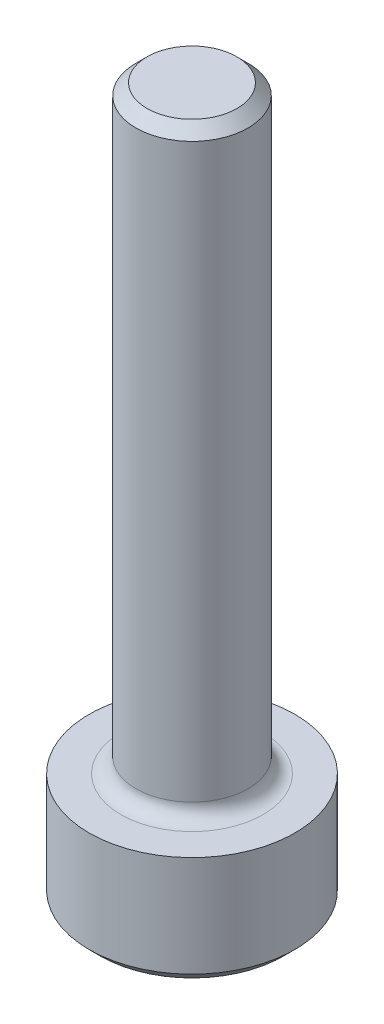
ISO-10303-21;
HEADER;
FILE_DESCRIPTION(('STEP AP214'),'2;1');
FILE_NAME('part.step','',(''),(''),'','','');
FILE_SCHEMA(('AUTOMOTIVE_DESIGN { 1 0 10303 214 1 1 1 1 }'));
ENDSEC;
DATA;
#1=APPLICATION_CONTEXT('core data for automotive mechanical design processes');
#2=APPLICATION_PROTOCOL_DEFINITION('international standard','automotive_design',2000,#1);
#3=PRODUCT_CONTEXT('',#1,'mechanical');
#4=PRODUCT('Part','Part','',(#3));
#5=PRODUCT_RELATED_PRODUCT_CATEGORY('part','',(#4));
#6=PRODUCT_DEFINITION_FORMATION('','',#4);
#7=PRODUCT_DEFINITION_CONTEXT('part definition',#1,'design');
#8=PRODUCT_DEFINITION('design','',#6,#7);
#9=PRODUCT_DEFINITION_SHAPE('','',#8);
#10=(LENGTH_UNIT() NAMED_UNIT(*) SI_UNIT(.MILLI.,.METRE.));
#11=(NAMED_UNIT(*) PLANE_ANGLE_UNIT() SI_UNIT($,.RADIAN.));
#12=(NAMED_UNIT(*) SI_UNIT($,.STERADIAN.) SOLID_ANGLE_UNIT());
#13=UNCERTAINTY_MEASURE_WITH_UNIT(LENGTH_MEASURE(1.E-05),#10,'distance_accuracy_value','');
#14=(GEOMETRIC_REPRESENTATION_CONTEXT(3) GLOBAL_UNCERTAINTY_ASSIGNED_CONTEXT((#13)) GLOBAL_UNIT_ASSIGNED_CONTEXT((#10,
#11,#12)) REPRESENTATION_CONTEXT('',''));
#15=CARTESIAN_POINT('',(0.,0.,0.));
#16=DIRECTION('',(0.,0.,1.));
#17=DIRECTION('',(1.,0.,0.));
#18=AXIS2_PLACEMENT_3D('',#15,#16,#17);
#19=CARTESIAN_POINT('',(0.,16.,0.));
#20=DIRECTION('',(0.,-1.,0.));
#21=DIRECTION('',(0.,0.,-1.));
#22=AXIS2_PLACEMENT_3D('',#19,#20,#21);
#23=CYLINDRICAL_SURFACE('',#22,1.5);
#24=CARTESIAN_POINT('',(0.,15.7,0.));
#25=DIRECTION('',(0.,1.,0.));
#26=DIRECTION('',(0.,0.,1.));
#27=AXIS2_PLACEMENT_3D('',#24,#25,#26);
#28=CIRCLE('',#27,1.5);
#29=CARTESIAN_POINT('',(0.,15.7,1.5));
#30=VERTEX_POINT('',#29);
#31=EDGE_CURVE('E11',#30,#30,#28,.F.);
#32=ORIENTED_EDGE('',*,*,#31,.T.);
#33=EDGE_LOOP('',(#32));
#34=FACE_BOUND('',#33,.T.);
#35=CARTESIAN_POINT('',(0.,0.399999999999999,0.));
#36=DIRECTION('',(0.,1.,0.));
#37=DIRECTION('',(0.,0.,1.));
#38=AXIS2_PLACEMENT_3D('',#35,#36,#37);
#39=CIRCLE('',#38,1.5);
#40=CARTESIAN_POINT('',(0.,0.399999999999999,1.5));
#41=VERTEX_POINT('',#40);
#42=EDGE_CURVE('E145',#41,#41,#39,.T.);
#43=ORIENTED_EDGE('',*,*,#42,.T.);
#44=EDGE_LOOP('',(#43));
#45=FACE_BOUND('',#44,.T.);
#46=ADVANCED_FACE('F35',(#34,#45),#23,.T.);
#47=CARTESIAN_POINT('',(0.,16.,0.));
#48=DIRECTION('',(0.,1.,0.));
#49=DIRECTION('',(0.,0.,1.));
#50=AXIS2_PLACEMENT_3D('',#47,#48,#49);
#51=PLANE('',#50);
#52=CARTESIAN_POINT('',(0.,16.,0.));
#53=DIRECTION('',(0.,1.,0.));
#54=DIRECTION('',(0.,0.,1.));
#55=AXIS2_PLACEMENT_3D('',#52,#53,#54);
#56=CIRCLE('',#55,1.2);
#57=CARTESIAN_POINT('',(0.,16.,1.2));
#58=VERTEX_POINT('',#57);
#59=EDGE_CURVE('E43',#58,#58,#56,.T.);
#60=ORIENTED_EDGE('',*,*,#59,.T.);
#61=EDGE_LOOP('',(#60));
#62=FACE_BOUND('',#61,.T.);
#63=ADVANCED_FACE('F159',(#62),#51,.T.);
#64=CARTESIAN_POINT('',(0.,-3.,0.));
#65=DIRECTION('',(0.,1.,0.));
#66=DIRECTION('',(0.,0.,1.));
#67=AXIS2_PLACEMENT_3D('',#64,#65,#66);
#68=CYLINDRICAL_SURFACE('',#67,2.75);
#69=CARTESIAN_POINT('',(0.,-2.70000000000001,0.));
#70=DIRECTION('',(0.,1.,0.));
#71=DIRECTION('',(0.,0.,1.));
#72=AXIS2_PLACEMENT_3D('',#69,#70,#71);
#73=CIRCLE('',#72,2.75);
#74=CARTESIAN_POINT('',(0.,-2.70000000000001,2.75));
#75=VERTEX_POINT('',#74);
#76=EDGE_CURVE('E151',#75,#75,#73,.T.);
#77=ORIENTED_EDGE('',*,*,#76,.T.);
#78=EDGE_LOOP('',(#77));
#79=FACE_BOUND('',#78,.T.);
#80=CARTESIAN_POINT('',(0.,0.,0.));
#81=DIRECTION('',(0.,1.,0.));
#82=DIRECTION('',(0.,0.,1.));
#83=AXIS2_PLACEMENT_3D('',#80,#81,#82);
#84=CIRCLE('',#83,2.75);
#85=CARTESIAN_POINT('',(0.,0.,2.75));
#86=VERTEX_POINT('',#85);
#87=EDGE_CURVE('E137',#86,#86,#84,.T.);
#88=ORIENTED_EDGE('',*,*,#87,.F.);
#89=EDGE_LOOP('',(#88));
#90=FACE_BOUND('',#89,.T.);
#91=ADVANCED_FACE('F180',(#79,#90),#68,.T.);
#92=CARTESIAN_POINT('',(0.,-3.,0.));
#93=DIRECTION('',(0.,1.,0.));
#94=DIRECTION('',(0.,0.,1.));
#95=AXIS2_PLACEMENT_3D('',#92,#93,#94);
#96=PLANE('',#95);
#97=DIRECTION('',(-0.866025403784439,0.,-0.5));
#98=VECTOR('',#97,1.);
#99=CARTESIAN_POINT('',(0.,-3.,1.44337567297406));
#100=LINE('',#99,#98);
#101=CARTESIAN_POINT('',(0.,-3.,1.44337567297406));
#102=VERTEX_POINT('',#101);
#103=CARTESIAN_POINT('',(-1.25,-3.,0.721687836487032));
#104=VERTEX_POINT('',#103);
#105=EDGE_CURVE('E124',#102,#104,#100,.T.);
#106=ORIENTED_EDGE('',*,*,#105,.F.);
#107=DIRECTION('',(-0.866025403784439,0.,0.5));
#108=VECTOR('',#107,1.);
#109=CARTESIAN_POINT('',(1.25,-3.,0.721687836487033));
#110=LINE('',#109,#108);
#111=CARTESIAN_POINT('',(1.25,-3.,0.721687836487033));
#112=VERTEX_POINT('',#111);
#113=EDGE_CURVE('E50',#112,#102,#110,.T.);
#114=ORIENTED_EDGE('',*,*,#113,.F.);
#115=DIRECTION('',(0.,0.,1.));
#116=VECTOR('',#115,1.);
#117=CARTESIAN_POINT('',(1.25,-3.,-0.721687836487033));
#118=LINE('',#117,#116);
#119=CARTESIAN_POINT('',(1.25,-3.,-0.721687836487033));
#120=VERTEX_POINT('',#119);
#121=EDGE_CURVE('E133',#120,#112,#118,.T.);
#122=ORIENTED_EDGE('',*,*,#121,.F.);
#123=DIRECTION('',(0.866025403784439,0.,0.5));
#124=VECTOR('',#123,1.);
#125=CARTESIAN_POINT('',(0.,-3.,-1.44337567297406));
#126=LINE('',#125,#124);
#127=CARTESIAN_POINT('',(0.,-3.,-1.44337567297406));
#128=VERTEX_POINT('',#127);
#129=EDGE_CURVE('E131',#128,#120,#126,.T.);
#130=ORIENTED_EDGE('',*,*,#129,.F.);
#131=DIRECTION('',(0.866025403784439,0.,-0.5));
#132=VECTOR('',#131,1.);
#133=CARTESIAN_POINT('',(-1.25,-3.,-0.721687836487033));
#134=LINE('',#133,#132);
#135=CARTESIAN_POINT('',(-1.25,-3.,-0.721687836487033));
#136=VERTEX_POINT('',#135);
#137=EDGE_CURVE('E98',#136,#128,#134,.T.);
#138=ORIENTED_EDGE('',*,*,#137,.F.);
#139=DIRECTION('',(0.,0.,-1.));
#140=VECTOR('',#139,1.);
#141=CARTESIAN_POINT('',(-1.25,-3.,0.721687836487032));
#142=LINE('',#141,#140);
#143=EDGE_CURVE('E127',#104,#136,#142,.T.);
#144=ORIENTED_EDGE('',*,*,#143,.F.);
#145=EDGE_LOOP('',(#106,#114,#122,#130,#138,#144));
#146=FACE_BOUND('',#145,.T.);
#147=CARTESIAN_POINT('',(0.,-3.,0.));
#148=DIRECTION('',(0.,1.,0.));
#149=DIRECTION('',(0.,0.,1.));
#150=AXIS2_PLACEMENT_3D('',#147,#148,#149);
#151=CIRCLE('',#150,2.45000000000001);
#152=CARTESIAN_POINT('',(0.,-3.,2.45000000000001));
#153=VERTEX_POINT('',#152);
#154=EDGE_CURVE('E154',#153,#153,#151,.F.);
#155=ORIENTED_EDGE('',*,*,#154,.T.);
#156=EDGE_LOOP('',(#155));
#157=FACE_BOUND('',#156,.T.);
#158=ADVANCED_FACE('F191',(#146,#157),#96,.F.);
#159=CARTESIAN_POINT('',(0.,0.,0.));
#160=DIRECTION('',(0.,1.,0.));
#161=DIRECTION('',(0.,0.,1.));
#162=AXIS2_PLACEMENT_3D('',#159,#160,#161);
#163=PLANE('',#162);
#164=CARTESIAN_POINT('',(0.,0.,0.));
#165=DIRECTION('',(0.,1.,0.));
#166=DIRECTION('',(0.,0.,1.));
#167=AXIS2_PLACEMENT_3D('',#164,#165,#166);
#168=CIRCLE('',#167,1.9);
#169=CARTESIAN_POINT('',(0.,0.,1.9));
#170=VERTEX_POINT('',#169);
#171=EDGE_CURVE('E148',#170,#170,#168,.F.);
#172=ORIENTED_EDGE('',*,*,#171,.T.);
#173=EDGE_LOOP('',(#172));
#174=FACE_BOUND('',#173,.T.);
#175=ORIENTED_EDGE('',*,*,#87,.T.);
#176=EDGE_LOOP('',(#175));
#177=FACE_BOUND('',#176,.T.);
#178=ADVANCED_FACE('F186',(#174,#177),#163,.T.);
#179=CARTESIAN_POINT('',(0.,0.399999999999999,0.));
#180=DIRECTION('',(0.,1.,0.));
#181=DIRECTION('',(0.,0.,1.));
#182=AXIS2_PLACEMENT_3D('',#179,#180,#181);
#183=TOROIDAL_SURFACE('',#182,1.9,0.4);
#184=ORIENTED_EDGE('',*,*,#171,.F.);
#185=EDGE_LOOP('',(#184));
#186=FACE_BOUND('',#185,.T.);
#187=ORIENTED_EDGE('',*,*,#42,.F.);
#188=EDGE_LOOP('',(#187));
#189=FACE_BOUND('',#188,.T.);
#190=ADVANCED_FACE('F171',(#186,#189),#183,.F.);
#191=CARTESIAN_POINT('',(0.,-2.70000000000001,0.));
#192=DIRECTION('',(0.,1.,0.));
#193=DIRECTION('',(0.,0.,1.));
#194=AXIS2_PLACEMENT_3D('',#191,#192,#193);
#195=CONICAL_SURFACE('',#194,2.75,0.785398163397447);
#196=ORIENTED_EDGE('',*,*,#154,.F.);
#197=EDGE_LOOP('',(#196));
#198=FACE_BOUND('',#197,.T.);
#199=ORIENTED_EDGE('',*,*,#76,.F.);
#200=EDGE_LOOP('',(#199));
#201=FACE_BOUND('',#200,.T.);
#202=ADVANCED_FACE('F163',(#198,#201),#195,.T.);
#203=CARTESIAN_POINT('',(0.,16.,0.));
#204=DIRECTION('',(0.,-1.,0.));
#205=DIRECTION('',(0.,0.,-1.));
#206=AXIS2_PLACEMENT_3D('',#203,#204,#205);
#207=CONICAL_SURFACE('',#206,1.2,0.785398163397447);
#208=ORIENTED_EDGE('',*,*,#31,.F.);
#209=EDGE_LOOP('',(#208));
#210=FACE_BOUND('',#209,.T.);
#211=ORIENTED_EDGE('',*,*,#59,.F.);
#212=EDGE_LOOP('',(#211));
#213=FACE_BOUND('',#212,.T.);
#214=ADVANCED_FACE('F37',(#210,#213),#207,.T.);
#215=CARTESIAN_POINT('',(1.25,-0.5,0.721687836487033));
#216=DIRECTION('',(0.5,0.,0.866025403784439));
#217=DIRECTION('',(0.866025403784439,0.,-0.5));
#218=AXIS2_PLACEMENT_3D('',#215,#216,#217);
#219=PLANE('',#218);
#220=ORIENTED_EDGE('',*,*,#113,.T.);
#221=DIRECTION('',(0.,-1.,0.));
#222=VECTOR('',#221,1.);
#223=CARTESIAN_POINT('',(0.,-0.5,1.44337567297406));
#224=LINE('',#223,#222);
#225=CARTESIAN_POINT('',(0.,-0.5,1.44337567297406));
#226=VERTEX_POINT('',#225);
#227=EDGE_CURVE('E80',#226,#102,#224,.T.);
#228=ORIENTED_EDGE('',*,*,#227,.F.);
#229=DIRECTION('',(-0.866025403784439,0.,0.5));
#230=VECTOR('',#229,1.);
#231=CARTESIAN_POINT('',(1.25,-0.5,0.721687836487033));
#232=LINE('',#231,#230);
#233=CARTESIAN_POINT('',(1.25,-0.5,0.721687836487033));
#234=VERTEX_POINT('',#233);
#235=EDGE_CURVE('E135',#234,#226,#232,.T.);
#236=ORIENTED_EDGE('',*,*,#235,.F.);
#237=DIRECTION('',(0.,-1.,0.));
#238=VECTOR('',#237,1.);
#239=CARTESIAN_POINT('',(1.25,-0.5,0.721687836487033));
#240=LINE('',#239,#238);
#241=EDGE_CURVE('E58',#234,#112,#240,.T.);
#242=ORIENTED_EDGE('',*,*,#241,.T.);
#243=EDGE_LOOP('',(#220,#228,#236,#242));
#244=FACE_BOUND('',#243,.T.);
#245=ADVANCED_FACE('F162',(#244),#219,.F.);
#246=CARTESIAN_POINT('',(1.25,-0.5,-0.721687836487033));
#247=DIRECTION('',(1.,0.,0.));
#248=DIRECTION('',(0.,0.,-1.));
#249=AXIS2_PLACEMENT_3D('',#246,#247,#248);
#250=PLANE('',#249);
#251=ORIENTED_EDGE('',*,*,#121,.T.);
#252=ORIENTED_EDGE('',*,*,#241,.F.);
#253=DIRECTION('',(0.,0.,1.));
#254=VECTOR('',#253,1.);
#255=CARTESIAN_POINT('',(1.25,-0.5,-0.721687836487033));
#256=LINE('',#255,#254);
#257=CARTESIAN_POINT('',(1.25,-0.5,-0.721687836487033));
#258=VERTEX_POINT('',#257);
#259=EDGE_CURVE('E110',#258,#234,#256,.T.);
#260=ORIENTED_EDGE('',*,*,#259,.F.);
#261=DIRECTION('',(0.,-1.,0.));
#262=VECTOR('',#261,1.);
#263=CARTESIAN_POINT('',(1.25,-0.5,-0.721687836487033));
#264=LINE('',#263,#262);
#265=EDGE_CURVE('E102',#258,#120,#264,.T.);
#266=ORIENTED_EDGE('',*,*,#265,.T.);
#267=EDGE_LOOP('',(#251,#252,#260,#266));
#268=FACE_BOUND('',#267,.T.);
#269=ADVANCED_FACE('F169',(#268),#250,.F.);
#270=CARTESIAN_POINT('',(0.,-0.5,-1.44337567297406));
#271=DIRECTION('',(0.5,0.,-0.866025403784439));
#272=DIRECTION('',(-0.866025403784439,0.,-0.5));
#273=AXIS2_PLACEMENT_3D('',#270,#271,#272);
#274=PLANE('',#273);
#275=ORIENTED_EDGE('',*,*,#129,.T.);
#276=ORIENTED_EDGE('',*,*,#265,.F.);
#277=DIRECTION('',(0.866025403784439,0.,0.5));
#278=VECTOR('',#277,1.);
#279=CARTESIAN_POINT('',(0.,-0.5,-1.44337567297406));
#280=LINE('',#279,#278);
#281=CARTESIAN_POINT('',(0.,-0.5,-1.44337567297406));
#282=VERTEX_POINT('',#281);
#283=EDGE_CURVE('E106',#282,#258,#280,.T.);
#284=ORIENTED_EDGE('',*,*,#283,.F.);
#285=DIRECTION('',(0.,-1.,0.));
#286=VECTOR('',#285,1.);
#287=CARTESIAN_POINT('',(0.,-0.5,-1.44337567297406));
#288=LINE('',#287,#286);
#289=EDGE_CURVE('E91',#282,#128,#288,.T.);
#290=ORIENTED_EDGE('',*,*,#289,.T.);
#291=EDGE_LOOP('',(#275,#276,#284,#290));
#292=FACE_BOUND('',#291,.T.);
#293=ADVANCED_FACE('F107',(#292),#274,.F.);
#294=CARTESIAN_POINT('',(-1.25,-0.5,-0.721687836487033));
#295=DIRECTION('',(-0.5,0.,-0.866025403784439));
#296=DIRECTION('',(-0.866025403784439,0.,0.5));
#297=AXIS2_PLACEMENT_3D('',#294,#295,#296);
#298=PLANE('',#297);
#299=ORIENTED_EDGE('',*,*,#137,.T.);
#300=ORIENTED_EDGE('',*,*,#289,.F.);
#301=DIRECTION('',(0.866025403784439,0.,-0.5));
#302=VECTOR('',#301,1.);
#303=CARTESIAN_POINT('',(-1.25,-0.5,-0.721687836487033));
#304=LINE('',#303,#302);
#305=CARTESIAN_POINT('',(-1.25,-0.5,-0.721687836487033));
#306=VERTEX_POINT('',#305);
#307=EDGE_CURVE('E95',#306,#282,#304,.T.);
#308=ORIENTED_EDGE('',*,*,#307,.F.);
#309=DIRECTION('',(0.,-1.,0.));
#310=VECTOR('',#309,1.);
#311=CARTESIAN_POINT('',(-1.25,-0.5,-0.721687836487033));
#312=LINE('',#311,#310);
#313=EDGE_CURVE('E103',#306,#136,#312,.T.);
#314=ORIENTED_EDGE('',*,*,#313,.T.);
#315=EDGE_LOOP('',(#299,#300,#308,#314));
#316=FACE_BOUND('',#315,.T.);
#317=ADVANCED_FACE('F93',(#316),#298,.F.);
#318=CARTESIAN_POINT('',(-1.25,-0.5,0.721687836487032));
#319=DIRECTION('',(-1.,0.,0.));
#320=DIRECTION('',(0.,0.,1.));
#321=AXIS2_PLACEMENT_3D('',#318,#319,#320);
#322=PLANE('',#321);
#323=ORIENTED_EDGE('',*,*,#143,.T.);
#324=ORIENTED_EDGE('',*,*,#313,.F.);
#325=DIRECTION('',(0.,0.,-1.));
#326=VECTOR('',#325,1.);
#327=CARTESIAN_POINT('',(-1.25,-0.5,0.721687836487032));
#328=LINE('',#327,#326);
#329=CARTESIAN_POINT('',(-1.25,-0.5,0.721687836487032));
#330=VERTEX_POINT('',#329);
#331=EDGE_CURVE('E116',#330,#306,#328,.T.);
#332=ORIENTED_EDGE('',*,*,#331,.F.);
#333=DIRECTION('',(0.,-1.,0.));
#334=VECTOR('',#333,1.);
#335=CARTESIAN_POINT('',(-1.25,-0.5,0.721687836487032));
#336=LINE('',#335,#334);
#337=EDGE_CURVE('E140',#330,#104,#336,.T.);
#338=ORIENTED_EDGE('',*,*,#337,.T.);
#339=EDGE_LOOP('',(#323,#324,#332,#338));
#340=FACE_BOUND('',#339,.T.);
#341=ADVANCED_FACE('F211',(#340),#322,.F.);
#342=CARTESIAN_POINT('',(0.,-0.5,1.44337567297406));
#343=DIRECTION('',(-0.5,0.,0.866025403784439));
#344=DIRECTION('',(0.866025403784439,0.,0.5));
#345=AXIS2_PLACEMENT_3D('',#342,#343,#344);
#346=PLANE('',#345);
#347=ORIENTED_EDGE('',*,*,#105,.T.);
#348=ORIENTED_EDGE('',*,*,#337,.F.);
#349=DIRECTION('',(-0.866025403784439,0.,-0.5));
#350=VECTOR('',#349,1.);
#351=CARTESIAN_POINT('',(0.,-0.5,1.44337567297406));
#352=LINE('',#351,#350);
#353=EDGE_CURVE('E118',#226,#330,#352,.T.);
#354=ORIENTED_EDGE('',*,*,#353,.F.);
#355=ORIENTED_EDGE('',*,*,#227,.T.);
#356=EDGE_LOOP('',(#347,#348,#354,#355));
#357=FACE_BOUND('',#356,.T.);
#358=ADVANCED_FACE('F208',(#357),#346,.F.);
#359=CARTESIAN_POINT('',(0.,-0.5,0.));
#360=DIRECTION('',(0.,-1.,0.));
#361=DIRECTION('',(0.,0.,-1.));
#362=AXIS2_PLACEMENT_3D('',#359,#360,#361);
#363=PLANE('',#362);
#364=ORIENTED_EDGE('',*,*,#235,.T.);
#365=ORIENTED_EDGE('',*,*,#353,.T.);
#366=ORIENTED_EDGE('',*,*,#331,.T.);
#367=ORIENTED_EDGE('',*,*,#307,.T.);
#368=ORIENTED_EDGE('',*,*,#283,.T.);
#369=ORIENTED_EDGE('',*,*,#259,.T.);
#370=EDGE_LOOP('',(#364,#365,#366,#367,#368,#369));
#371=FACE_BOUND('',#370,.T.);
#372=ADVANCED_FACE('F113',(#371),#363,.T.);
#373=CLOSED_SHELL('',(#46,#63,#91,#158,#178,#190,#202,#214,#245,#269,#293,#317,#341,#358,#372));
#374=MANIFOLD_SOLID_BREP('B2',#373);
#375=ADVANCED_BREP_SHAPE_REPRESENTATION('',(#18,#374),#14);
#376=SHAPE_DEFINITION_REPRESENTATION(#9,#375);
ENDSEC;
END-ISO-10303-21;
